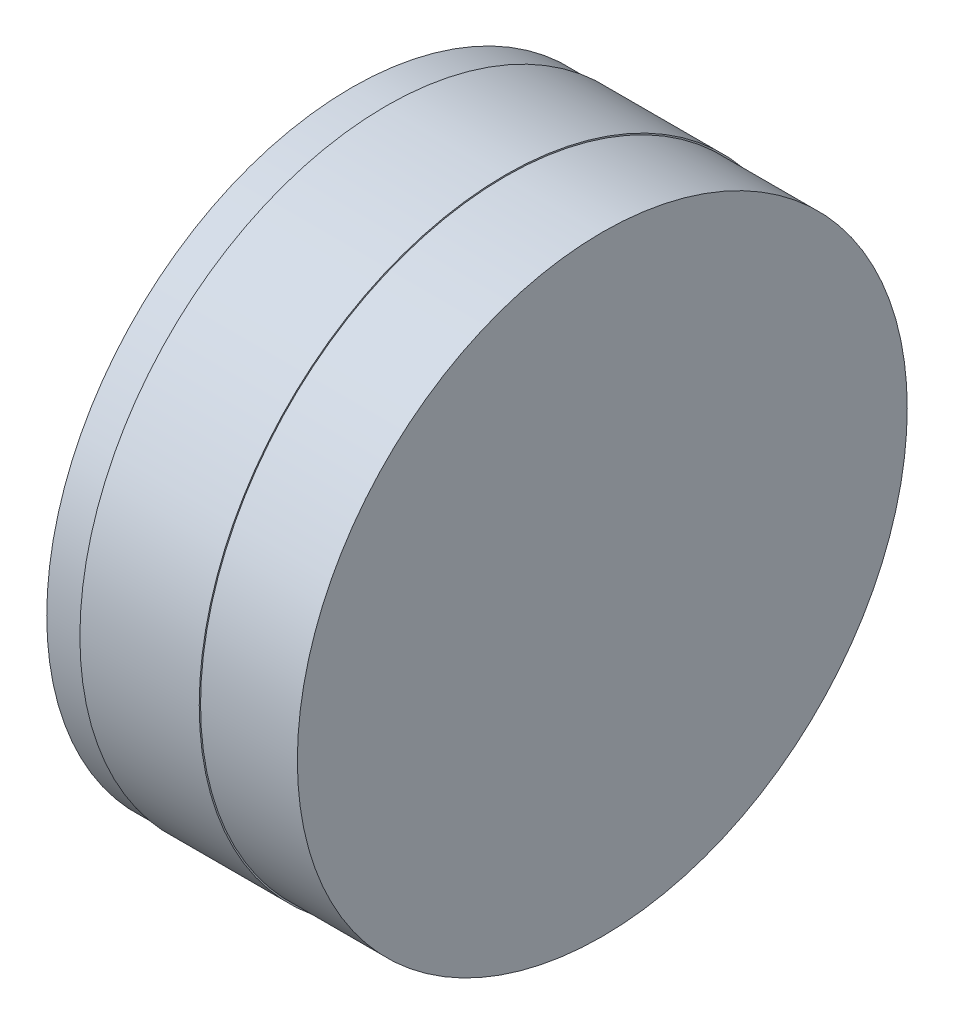
ISO-10303-21;
HEADER;
FILE_DESCRIPTION(('STEP AP214'),'2;1');
FILE_NAME('part.step','',(''),(''),'','','');
FILE_SCHEMA(('AUTOMOTIVE_DESIGN { 1 0 10303 214 1 1 1 1 }'));
ENDSEC;
DATA;
#1=APPLICATION_CONTEXT('core data for automotive mechanical design processes');
#2=APPLICATION_PROTOCOL_DEFINITION('international standard','automotive_design',2000,#1);
#3=PRODUCT_CONTEXT('',#1,'mechanical');
#4=PRODUCT('Part','Part','',(#3));
#5=PRODUCT_RELATED_PRODUCT_CATEGORY('part','',(#4));
#6=PRODUCT_DEFINITION_FORMATION('','',#4);
#7=PRODUCT_DEFINITION_CONTEXT('part definition',#1,'design');
#8=PRODUCT_DEFINITION('design','',#6,#7);
#9=PRODUCT_DEFINITION_SHAPE('','',#8);
#10=(LENGTH_UNIT() NAMED_UNIT(*) SI_UNIT(.MILLI.,.METRE.));
#11=(NAMED_UNIT(*) PLANE_ANGLE_UNIT() SI_UNIT($,.RADIAN.));
#12=(NAMED_UNIT(*) SI_UNIT($,.STERADIAN.) SOLID_ANGLE_UNIT());
#13=UNCERTAINTY_MEASURE_WITH_UNIT(LENGTH_MEASURE(1.E-05),#10,'distance_accuracy_value','');
#14=(GEOMETRIC_REPRESENTATION_CONTEXT(3) GLOBAL_UNCERTAINTY_ASSIGNED_CONTEXT((#13)) GLOBAL_UNIT_ASSIGNED_CONTEXT((#10,
#11,#12)) REPRESENTATION_CONTEXT('',''));
#15=CARTESIAN_POINT('',(0.,0.,0.));
#16=DIRECTION('',(0.,0.,1.));
#17=DIRECTION('',(1.,0.,0.));
#18=AXIS2_PLACEMENT_3D('',#15,#16,#17);
#19=CARTESIAN_POINT('',(0.,0.,0.));
#20=DIRECTION('',(-1.,0.,0.));
#21=DIRECTION('',(0.,0.,1.));
#22=AXIS2_PLACEMENT_3D('',#19,#20,#21);
#23=CYLINDRICAL_SURFACE('',#22,21.);
#24=CARTESIAN_POINT('',(13.,0.,0.));
#25=DIRECTION('',(-1.,0.,0.));
#26=DIRECTION('',(0.,0.,1.));
#27=AXIS2_PLACEMENT_3D('',#24,#25,#26);
#28=CIRCLE('',#27,21.);
#29=CARTESIAN_POINT('',(13.,0.,21.));
#30=VERTEX_POINT('',#29);
#31=EDGE_CURVE('E65',#30,#30,#28,.T.);
#32=ORIENTED_EDGE('',*,*,#31,.F.);
#33=EDGE_LOOP('',(#32));
#34=FACE_BOUND('',#33,.T.);
#35=CARTESIAN_POINT('',(0.,0.,0.));
#36=DIRECTION('',(-1.,0.,0.));
#37=DIRECTION('',(0.,0.,1.));
#38=AXIS2_PLACEMENT_3D('',#35,#36,#37);
#39=CIRCLE('',#38,21.);
#40=CARTESIAN_POINT('',(0.,0.,21.));
#41=VERTEX_POINT('',#40);
#42=EDGE_CURVE('E10',#41,#41,#39,.T.);
#43=ORIENTED_EDGE('',*,*,#42,.T.);
#44=EDGE_LOOP('',(#43));
#45=FACE_BOUND('',#44,.T.);
#46=ADVANCED_FACE('F37',(#34,#45),#23,.F.);
#47=CARTESIAN_POINT('',(0.,21.,0.));
#48=DIRECTION('',(1.,0.,0.));
#49=DIRECTION('',(0.,0.,-1.));
#50=AXIS2_PLACEMENT_3D('',#47,#48,#49);
#51=PLANE('',#50);
#52=ORIENTED_EDGE('',*,*,#42,.F.);
#53=EDGE_LOOP('',(#52));
#54=FACE_BOUND('',#53,.T.);
#55=CARTESIAN_POINT('',(0.,0.,0.));
#56=DIRECTION('',(-1.,0.,0.));
#57=DIRECTION('',(0.,0.,1.));
#58=AXIS2_PLACEMENT_3D('',#55,#56,#57);
#59=CIRCLE('',#58,115.);
#60=CARTESIAN_POINT('',(0.,0.,115.));
#61=VERTEX_POINT('',#60);
#62=EDGE_CURVE('E43',#61,#61,#59,.T.);
#63=ORIENTED_EDGE('',*,*,#62,.T.);
#64=EDGE_LOOP('',(#63));
#65=FACE_BOUND('',#64,.T.);
#66=ADVANCED_FACE('F72',(#54,#65),#51,.F.);
#67=CARTESIAN_POINT('',(0.,0.,0.));
#68=DIRECTION('',(-1.,0.,0.));
#69=DIRECTION('',(0.,0.,1.));
#70=AXIS2_PLACEMENT_3D('',#67,#68,#69);
#71=CYLINDRICAL_SURFACE('',#70,115.);
#72=ORIENTED_EDGE('',*,*,#62,.F.);
#73=EDGE_LOOP('',(#72));
#74=FACE_BOUND('',#73,.T.);
#75=CARTESIAN_POINT('',(13.,0.,0.));
#76=DIRECTION('',(-1.,0.,0.));
#77=DIRECTION('',(0.,0.,1.));
#78=AXIS2_PLACEMENT_3D('',#75,#76,#77);
#79=CIRCLE('',#78,115.);
#80=CARTESIAN_POINT('',(13.,0.,115.));
#81=VERTEX_POINT('',#80);
#82=EDGE_CURVE('E47',#81,#81,#79,.T.);
#83=ORIENTED_EDGE('',*,*,#82,.T.);
#84=EDGE_LOOP('',(#83));
#85=FACE_BOUND('',#84,.T.);
#86=ADVANCED_FACE('F76',(#74,#85),#71,.T.);
#87=CARTESIAN_POINT('',(13.,115.,0.));
#88=DIRECTION('',(1.,0.,0.));
#89=DIRECTION('',(0.,0.,-1.));
#90=AXIS2_PLACEMENT_3D('',#87,#88,#89);
#91=PLANE('',#90);
#92=ORIENTED_EDGE('',*,*,#82,.F.);
#93=EDGE_LOOP('',(#92));
#94=FACE_BOUND('',#93,.T.);
#95=CARTESIAN_POINT('',(13.,0.,0.));
#96=DIRECTION('',(-1.,0.,0.));
#97=DIRECTION('',(0.,0.,1.));
#98=AXIS2_PLACEMENT_3D('',#95,#96,#97);
#99=CIRCLE('',#98,115.5);
#100=CARTESIAN_POINT('',(13.,0.,115.5));
#101=VERTEX_POINT('',#100);
#102=EDGE_CURVE('E51',#101,#101,#99,.T.);
#103=ORIENTED_EDGE('',*,*,#102,.T.);
#104=EDGE_LOOP('',(#103));
#105=FACE_BOUND('',#104,.T.);
#106=ADVANCED_FACE('F81',(#94,#105),#91,.F.);
#107=CARTESIAN_POINT('',(0.,0.,0.));
#108=DIRECTION('',(-1.,0.,0.));
#109=DIRECTION('',(0.,0.,1.));
#110=AXIS2_PLACEMENT_3D('',#107,#108,#109);
#111=CYLINDRICAL_SURFACE('',#110,115.5);
#112=ORIENTED_EDGE('',*,*,#102,.F.);
#113=EDGE_LOOP('',(#112));
#114=FACE_BOUND('',#113,.T.);
#115=CARTESIAN_POINT('',(58.,0.,0.));
#116=DIRECTION('',(-1.,0.,0.));
#117=DIRECTION('',(0.,0.,1.));
#118=AXIS2_PLACEMENT_3D('',#115,#116,#117);
#119=CIRCLE('',#118,115.5);
#120=CARTESIAN_POINT('',(58.,0.,115.5));
#121=VERTEX_POINT('',#120);
#122=EDGE_CURVE('E56',#121,#121,#119,.T.);
#123=ORIENTED_EDGE('',*,*,#122,.T.);
#124=EDGE_LOOP('',(#123));
#125=FACE_BOUND('',#124,.T.);
#126=ADVANCED_FACE('F87',(#114,#125),#111,.T.);
#127=CARTESIAN_POINT('',(58.,115.5,0.));
#128=DIRECTION('',(-1.,0.,0.));
#129=DIRECTION('',(0.,0.,1.));
#130=AXIS2_PLACEMENT_3D('',#127,#128,#129);
#131=PLANE('',#130);
#132=ORIENTED_EDGE('',*,*,#122,.F.);
#133=EDGE_LOOP('',(#132));
#134=FACE_BOUND('',#133,.T.);
#135=CARTESIAN_POINT('',(58.,0.,0.));
#136=DIRECTION('',(-1.,0.,0.));
#137=DIRECTION('',(0.,0.,1.));
#138=AXIS2_PLACEMENT_3D('',#135,#136,#137);
#139=CIRCLE('',#138,115.);
#140=CARTESIAN_POINT('',(58.,0.,115.));
#141=VERTEX_POINT('',#140);
#142=EDGE_CURVE('E59',#141,#141,#139,.T.);
#143=ORIENTED_EDGE('',*,*,#142,.T.);
#144=EDGE_LOOP('',(#143));
#145=FACE_BOUND('',#144,.T.);
#146=ADVANCED_FACE('F91',(#134,#145),#131,.F.);
#147=CARTESIAN_POINT('',(0.,0.,0.));
#148=DIRECTION('',(-1.,0.,0.));
#149=DIRECTION('',(0.,0.,1.));
#150=AXIS2_PLACEMENT_3D('',#147,#148,#149);
#151=CYLINDRICAL_SURFACE('',#150,115.);
#152=ORIENTED_EDGE('',*,*,#142,.F.);
#153=EDGE_LOOP('',(#152));
#154=FACE_BOUND('',#153,.T.);
#155=CARTESIAN_POINT('',(94.5,0.,0.));
#156=DIRECTION('',(-1.,0.,0.));
#157=DIRECTION('',(0.,0.,1.));
#158=AXIS2_PLACEMENT_3D('',#155,#156,#157);
#159=CIRCLE('',#158,115.);
#160=CARTESIAN_POINT('',(94.5,0.,115.));
#161=VERTEX_POINT('',#160);
#162=EDGE_CURVE('E62',#161,#161,#159,.T.);
#163=ORIENTED_EDGE('',*,*,#162,.T.);
#164=EDGE_LOOP('',(#163));
#165=FACE_BOUND('',#164,.T.);
#166=ADVANCED_FACE('F95',(#154,#165),#151,.T.);
#167=CARTESIAN_POINT('',(94.5,115.,0.));
#168=DIRECTION('',(-1.,0.,0.));
#169=DIRECTION('',(0.,0.,1.));
#170=AXIS2_PLACEMENT_3D('',#167,#168,#169);
#171=PLANE('',#170);
#172=ORIENTED_EDGE('',*,*,#162,.F.);
#173=EDGE_LOOP('',(#172));
#174=FACE_BOUND('',#173,.T.);
#175=ADVANCED_FACE('F99',(#174),#171,.F.);
#176=CARTESIAN_POINT('',(13.,0.,0.));
#177=DIRECTION('',(1.,0.,0.));
#178=DIRECTION('',(0.,0.,-1.));
#179=AXIS2_PLACEMENT_3D('',#176,#177,#178);
#180=PLANE('',#179);
#181=ORIENTED_EDGE('',*,*,#31,.T.);
#182=EDGE_LOOP('',(#181));
#183=FACE_BOUND('',#182,.T.);
#184=ADVANCED_FACE('F69',(#183),#180,.F.);
#185=CLOSED_SHELL('',(#46,#66,#86,#106,#126,#146,#166,#175,#184));
#186=MANIFOLD_SOLID_BREP('B2',#185);
#187=ADVANCED_BREP_SHAPE_REPRESENTATION('',(#18,#186),#14);
#188=SHAPE_DEFINITION_REPRESENTATION(#9,#187);
ENDSEC;
END-ISO-10303-21;
